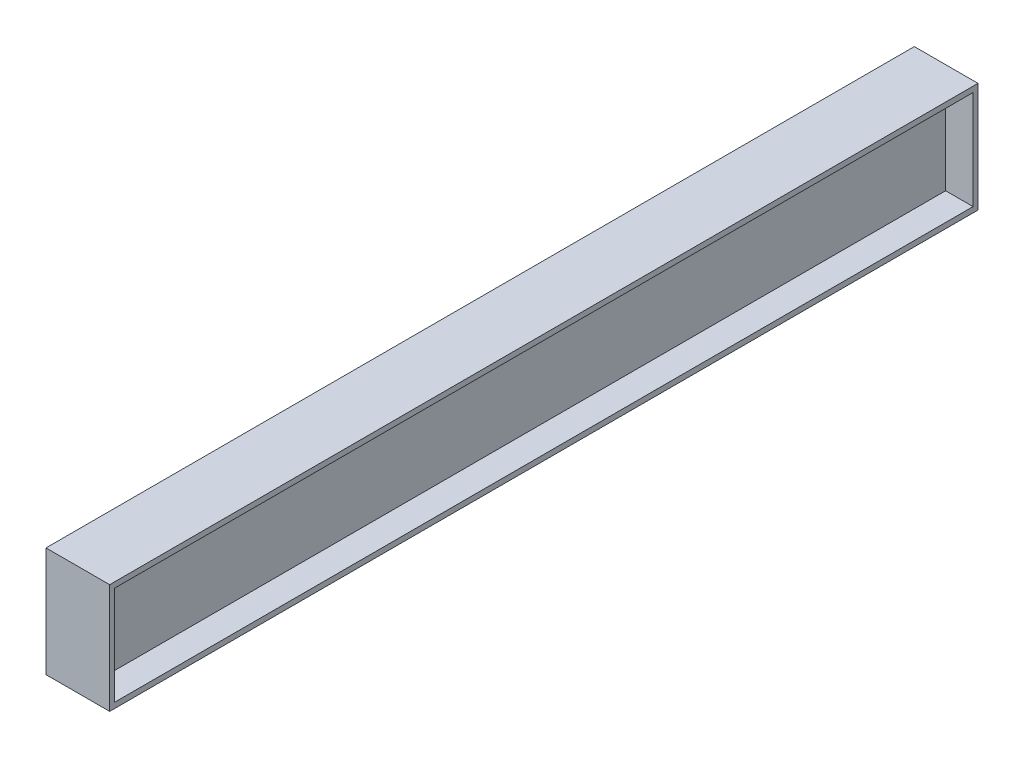
ISO-10303-21;
HEADER;
FILE_DESCRIPTION(('STEP AP214'),'2;1');
FILE_NAME('part.step','',(''),(''),'','','');
FILE_SCHEMA(('AUTOMOTIVE_DESIGN { 1 0 10303 214 1 1 1 1 }'));
ENDSEC;
DATA;
#1=APPLICATION_CONTEXT('core data for automotive mechanical design processes');
#2=APPLICATION_PROTOCOL_DEFINITION('international standard','automotive_design',2000,#1);
#3=PRODUCT_CONTEXT('',#1,'mechanical');
#4=PRODUCT('Part','Part','',(#3));
#5=PRODUCT_RELATED_PRODUCT_CATEGORY('part','',(#4));
#6=PRODUCT_DEFINITION_FORMATION('','',#4);
#7=PRODUCT_DEFINITION_CONTEXT('part definition',#1,'design');
#8=PRODUCT_DEFINITION('design','',#6,#7);
#9=PRODUCT_DEFINITION_SHAPE('','',#8);
#10=(LENGTH_UNIT() NAMED_UNIT(*) SI_UNIT(.MILLI.,.METRE.));
#11=(NAMED_UNIT(*) PLANE_ANGLE_UNIT() SI_UNIT($,.RADIAN.));
#12=(NAMED_UNIT(*) SI_UNIT($,.STERADIAN.) SOLID_ANGLE_UNIT());
#13=UNCERTAINTY_MEASURE_WITH_UNIT(LENGTH_MEASURE(1.E-05),#10,'distance_accuracy_value','');
#14=(GEOMETRIC_REPRESENTATION_CONTEXT(3) GLOBAL_UNCERTAINTY_ASSIGNED_CONTEXT((#13)) GLOBAL_UNIT_ASSIGNED_CONTEXT((#10,
#11,#12)) REPRESENTATION_CONTEXT('',''));
#15=CARTESIAN_POINT('',(0.,0.,0.));
#16=DIRECTION('',(0.,0.,1.));
#17=DIRECTION('',(1.,0.,0.));
#18=AXIS2_PLACEMENT_3D('',#15,#16,#17);
#19=CARTESIAN_POINT('',(96.6666666666667,-154.453875319659,2636.78));
#20=DIRECTION('',(0.,-1.,0.));
#21=DIRECTION('',(0.,0.,-1.));
#22=AXIS2_PLACEMENT_3D('',#19,#20,#21);
#23=PLANE('',#22);
#24=DIRECTION('',(1.,0.,0.));
#25=VECTOR('',#24,1.);
#26=CARTESIAN_POINT('',(-96.6663333333334,-154.453875319659,2621.78));
#27=LINE('',#26,#25);
#28=CARTESIAN_POINT('',(13.3333333333333,-154.453875319659,2621.78));
#29=VERTEX_POINT('',#28);
#30=CARTESIAN_POINT('',(96.6666666666667,-154.453875319659,2621.78));
#31=VERTEX_POINT('',#30);
#32=EDGE_CURVE('E149',#29,#31,#27,.T.);
#33=ORIENTED_EDGE('',*,*,#32,.T.);
#34=DIRECTION('',(0.,0.,-1.));
#35=VECTOR('',#34,1.);
#36=CARTESIAN_POINT('',(96.6666666666667,-154.453875319659,2636.78));
#37=LINE('',#36,#35);
#38=CARTESIAN_POINT('',(96.6666666666667,-154.453875319659,15.0000000000001));
#39=VERTEX_POINT('',#38);
#40=EDGE_CURVE('E232',#31,#39,#37,.T.);
#41=ORIENTED_EDGE('',*,*,#40,.T.);
#42=DIRECTION('',(-1.,0.,0.));
#43=VECTOR('',#42,1.);
#44=CARTESIAN_POINT('',(96.6666666666667,-154.453875319659,15.));
#45=LINE('',#44,#43);
#46=CARTESIAN_POINT('',(13.3333333333333,-154.453875319659,15.0000000000001));
#47=VERTEX_POINT('',#46);
#48=EDGE_CURVE('E174',#39,#47,#45,.T.);
#49=ORIENTED_EDGE('',*,*,#48,.T.);
#50=DIRECTION('',(0.,0.,-1.));
#51=VECTOR('',#50,1.);
#52=CARTESIAN_POINT('',(13.3333333333333,-154.453875319659,2636.78));
#53=LINE('',#52,#51);
#54=EDGE_CURVE('E230',#29,#47,#53,.T.);
#55=ORIENTED_EDGE('',*,*,#54,.F.);
#56=EDGE_LOOP('',(#33,#41,#49,#55));
#57=FACE_BOUND('',#56,.T.);
#58=ADVANCED_FACE('F35',(#57),#23,.F.);
#59=CARTESIAN_POINT('',(13.3333333333333,-154.453875319659,2636.78));
#60=DIRECTION('',(-1.,0.,0.));
#61=DIRECTION('',(0.,0.,1.));
#62=AXIS2_PLACEMENT_3D('',#59,#60,#61);
#63=PLANE('',#62);
#64=DIRECTION('',(0.,1.,0.));
#65=VECTOR('',#64,1.);
#66=CARTESIAN_POINT('',(13.3333333333333,-154.453875319659,2621.78));
#67=LINE('',#66,#65);
#68=CARTESIAN_POINT('',(13.3333333333333,145.546124680341,2621.78));
#69=VERTEX_POINT('',#68);
#70=EDGE_CURVE('E162',#29,#69,#67,.T.);
#71=ORIENTED_EDGE('',*,*,#70,.F.);
#72=ORIENTED_EDGE('',*,*,#54,.T.);
#73=DIRECTION('',(0.,-1.,0.));
#74=VECTOR('',#73,1.);
#75=CARTESIAN_POINT('',(13.3333333333333,-154.453875319659,15.0000000000001));
#76=LINE('',#75,#74);
#77=CARTESIAN_POINT('',(13.3333333333333,145.546124680341,15.0000000000001));
#78=VERTEX_POINT('',#77);
#79=EDGE_CURVE('E192',#78,#47,#76,.T.);
#80=ORIENTED_EDGE('',*,*,#79,.F.);
#81=DIRECTION('',(0.,0.,-1.));
#82=VECTOR('',#81,1.);
#83=CARTESIAN_POINT('',(13.3333333333333,145.546124680341,2636.78));
#84=LINE('',#83,#82);
#85=EDGE_CURVE('E228',#69,#78,#84,.T.);
#86=ORIENTED_EDGE('',*,*,#85,.F.);
#87=EDGE_LOOP('',(#71,#72,#80,#86));
#88=FACE_BOUND('',#87,.T.);
#89=ADVANCED_FACE('F296',(#88),#63,.F.);
#90=CARTESIAN_POINT('',(96.6666666666667,145.546124680341,2636.78));
#91=DIRECTION('',(0.,1.,0.));
#92=DIRECTION('',(0.,0.,1.));
#93=AXIS2_PLACEMENT_3D('',#90,#91,#92);
#94=PLANE('',#93);
#95=DIRECTION('',(-1.,0.,0.));
#96=VECTOR('',#95,1.);
#97=CARTESIAN_POINT('',(-96.6663333333334,145.546124680341,2621.78));
#98=LINE('',#97,#96);
#99=CARTESIAN_POINT('',(96.6666666666667,145.546124680341,2621.78));
#100=VERTEX_POINT('',#99);
#101=EDGE_CURVE('E160',#100,#69,#98,.T.);
#102=ORIENTED_EDGE('',*,*,#101,.T.);
#103=ORIENTED_EDGE('',*,*,#85,.T.);
#104=DIRECTION('',(1.,0.,0.));
#105=VECTOR('',#104,1.);
#106=CARTESIAN_POINT('',(96.6666666666667,145.546124680341,15.));
#107=LINE('',#106,#105);
#108=CARTESIAN_POINT('',(96.6666666666667,145.546124680341,14.9999999999997));
#109=VERTEX_POINT('',#108);
#110=EDGE_CURVE('E180',#78,#109,#107,.T.);
#111=ORIENTED_EDGE('',*,*,#110,.T.);
#112=DIRECTION('',(0.,0.,-1.));
#113=VECTOR('',#112,1.);
#114=CARTESIAN_POINT('',(96.6666666666667,145.546124680341,2636.78));
#115=LINE('',#114,#113);
#116=EDGE_CURVE('E226',#100,#109,#115,.T.);
#117=ORIENTED_EDGE('',*,*,#116,.F.);
#118=EDGE_LOOP('',(#102,#103,#111,#117));
#119=FACE_BOUND('',#118,.T.);
#120=ADVANCED_FACE('F282',(#119),#94,.F.);
#121=CARTESIAN_POINT('',(-13.3333333333333,145.546124680341,2636.78));
#122=DIRECTION('',(0.,1.,0.));
#123=DIRECTION('',(0.,0.,1.));
#124=AXIS2_PLACEMENT_3D('',#121,#122,#123);
#125=PLANE('',#124);
#126=CARTESIAN_POINT('',(-13.3333333333333,145.546124680341,2621.78));
#127=VERTEX_POINT('',#126);
#128=CARTESIAN_POINT('',(-96.6663333333334,145.546124680341,2621.78));
#129=VERTEX_POINT('',#128);
#130=EDGE_CURVE('E165',#127,#129,#98,.T.);
#131=ORIENTED_EDGE('',*,*,#130,.T.);
#132=DIRECTION('',(0.,0.,-1.));
#133=VECTOR('',#132,1.);
#134=CARTESIAN_POINT('',(-96.6663333333334,145.546124680341,2636.78));
#135=LINE('',#134,#133);
#136=CARTESIAN_POINT('',(-96.6663333333334,145.546124680341,15.0000000000001));
#137=VERTEX_POINT('',#136);
#138=EDGE_CURVE('E157',#129,#137,#135,.T.);
#139=ORIENTED_EDGE('',*,*,#138,.T.);
#140=CARTESIAN_POINT('',(-13.3333333333333,145.546124680341,15.0000000000001));
#141=VERTEX_POINT('',#140);
#142=EDGE_CURVE('E185',#137,#141,#107,.T.);
#143=ORIENTED_EDGE('',*,*,#142,.T.);
#144=DIRECTION('',(0.,0.,-1.));
#145=VECTOR('',#144,1.);
#146=CARTESIAN_POINT('',(-13.3333333333333,145.546124680341,2636.78));
#147=LINE('',#146,#145);
#148=EDGE_CURVE('E207',#127,#141,#147,.T.);
#149=ORIENTED_EDGE('',*,*,#148,.F.);
#150=EDGE_LOOP('',(#131,#139,#143,#149));
#151=FACE_BOUND('',#150,.T.);
#152=ADVANCED_FACE('F315',(#151),#125,.F.);
#153=CARTESIAN_POINT('',(-13.3333333333333,-4.45387531965855,2636.78));
#154=DIRECTION('',(1.,0.,0.));
#155=DIRECTION('',(0.,1.,0.));
#156=AXIS2_PLACEMENT_3D('',#153,#154,#155);
#157=PLANE('',#156);
#158=DIRECTION('',(0.,-1.,0.));
#159=VECTOR('',#158,1.);
#160=CARTESIAN_POINT('',(-13.3333333333333,-4.45387531965855,2621.78));
#161=LINE('',#160,#159);
#162=CARTESIAN_POINT('',(-13.3333333333333,-154.453875319659,2621.78));
#163=VERTEX_POINT('',#162);
#164=EDGE_CURVE('E145',#127,#163,#161,.T.);
#165=ORIENTED_EDGE('',*,*,#164,.F.);
#166=ORIENTED_EDGE('',*,*,#148,.T.);
#167=DIRECTION('',(0.,1.,0.));
#168=VECTOR('',#167,1.);
#169=CARTESIAN_POINT('',(-13.3333333333333,-4.45387531965855,15.0000000000001));
#170=LINE('',#169,#168);
#171=CARTESIAN_POINT('',(-13.3333333333333,-154.453875319659,15.0000000000001));
#172=VERTEX_POINT('',#171);
#173=EDGE_CURVE('E11',#172,#141,#170,.T.);
#174=ORIENTED_EDGE('',*,*,#173,.F.);
#175=DIRECTION('',(0.,0.,-1.));
#176=VECTOR('',#175,1.);
#177=CARTESIAN_POINT('',(-13.3333333333333,-154.453875319659,2636.78));
#178=LINE('',#177,#176);
#179=EDGE_CURVE('E43',#163,#172,#178,.T.);
#180=ORIENTED_EDGE('',*,*,#179,.F.);
#181=EDGE_LOOP('',(#165,#166,#174,#180));
#182=FACE_BOUND('',#181,.T.);
#183=ADVANCED_FACE('F243',(#182),#157,.F.);
#184=CARTESIAN_POINT('',(-13.3333333333333,-154.453875319659,2636.78));
#185=DIRECTION('',(0.,-1.,0.));
#186=DIRECTION('',(0.,0.,-1.));
#187=AXIS2_PLACEMENT_3D('',#184,#185,#186);
#188=PLANE('',#187);
#189=DIRECTION('',(-1.,0.,0.));
#190=VECTOR('',#189,1.);
#191=CARTESIAN_POINT('',(-13.3333333333333,-154.453875319659,2636.78));
#192=LINE('',#191,#190);
#193=CARTESIAN_POINT('',(-96.6663333333334,-154.453875319659,2636.78));
#194=VERTEX_POINT('',#193);
#195=CARTESIAN_POINT('',(-96.6666666666666,-154.453875319659,2636.78));
#196=VERTEX_POINT('',#195);
#197=EDGE_CURVE('E159',#194,#196,#192,.T.);
#198=ORIENTED_EDGE('',*,*,#197,.F.);
#199=DIRECTION('',(0.,0.,1.));
#200=VECTOR('',#199,1.);
#201=CARTESIAN_POINT('',(-96.6663333333334,-154.453875319659,2621.78));
#202=LINE('',#201,#200);
#203=CARTESIAN_POINT('',(-96.6663333333334,-154.453875319659,2621.78));
#204=VERTEX_POINT('',#203);
#205=EDGE_CURVE('E154',#204,#194,#202,.T.);
#206=ORIENTED_EDGE('',*,*,#205,.F.);
#207=EDGE_CURVE('E139',#204,#163,#27,.T.);
#208=ORIENTED_EDGE('',*,*,#207,.T.);
#209=ORIENTED_EDGE('',*,*,#179,.T.);
#210=CARTESIAN_POINT('',(-96.6666666666666,-154.453875319659,14.9999999999997));
#211=VERTEX_POINT('',#210);
#212=EDGE_CURVE('E58',#172,#211,#45,.T.);
#213=ORIENTED_EDGE('',*,*,#212,.T.);
#214=DIRECTION('',(0.,0.,-1.));
#215=VECTOR('',#214,1.);
#216=CARTESIAN_POINT('',(-96.6666666666666,-154.453875319659,2636.78));
#217=LINE('',#216,#215);
#218=EDGE_CURVE('E240',#196,#211,#217,.T.);
#219=ORIENTED_EDGE('',*,*,#218,.F.);
#220=EDGE_LOOP('',(#198,#206,#208,#209,#213,#219));
#221=FACE_BOUND('',#220,.T.);
#222=ADVANCED_FACE('F37',(#221),#188,.F.);
#223=CARTESIAN_POINT('',(-96.6666666666666,-171.120541986325,2636.78));
#224=DIRECTION('',(1.,0.,0.));
#225=DIRECTION('',(0.,0.,-1.));
#226=AXIS2_PLACEMENT_3D('',#223,#224,#225);
#227=PLANE('',#226);
#228=DIRECTION('',(0.,-1.,0.));
#229=VECTOR('',#228,1.);
#230=CARTESIAN_POINT('',(-96.6666666666666,-171.120541986325,0.));
#231=LINE('',#230,#229);
#232=CARTESIAN_POINT('',(-96.6666666666666,145.546124680341,0.));
#233=VERTEX_POINT('',#232);
#234=CARTESIAN_POINT('',(-96.6666666666666,-171.120541986325,0.));
#235=VERTEX_POINT('',#234);
#236=EDGE_CURVE('E195',#233,#235,#231,.T.);
#237=ORIENTED_EDGE('',*,*,#236,.T.);
#238=DIRECTION('',(0.,0.,-1.));
#239=VECTOR('',#238,1.);
#240=CARTESIAN_POINT('',(-96.6666666666666,-171.120541986325,2636.78));
#241=LINE('',#240,#239);
#242=CARTESIAN_POINT('',(-96.6666666666666,-171.120541986325,2636.78));
#243=VERTEX_POINT('',#242);
#244=EDGE_CURVE('E237',#243,#235,#241,.T.);
#245=ORIENTED_EDGE('',*,*,#244,.F.);
#246=DIRECTION('',(0.,-1.,0.));
#247=VECTOR('',#246,1.);
#248=CARTESIAN_POINT('',(-96.6666666666666,-171.120541986325,2636.78));
#249=LINE('',#248,#247);
#250=EDGE_CURVE('E197',#196,#243,#249,.T.);
#251=ORIENTED_EDGE('',*,*,#250,.F.);
#252=ORIENTED_EDGE('',*,*,#218,.T.);
#253=DIRECTION('',(0.,1.,0.));
#254=VECTOR('',#253,1.);
#255=CARTESIAN_POINT('',(-96.6666666666666,145.546124680341,15.));
#256=LINE('',#255,#254);
#257=CARTESIAN_POINT('',(-96.6666666666666,145.546124680341,15.));
#258=VERTEX_POINT('',#257);
#259=EDGE_CURVE('E177',#211,#258,#256,.T.);
#260=ORIENTED_EDGE('',*,*,#259,.T.);
#261=DIRECTION('',(0.,0.,-1.));
#262=VECTOR('',#261,1.);
#263=CARTESIAN_POINT('',(-96.6666666666666,145.546124680341,15.));
#264=LINE('',#263,#262);
#265=EDGE_CURVE('E184',#258,#233,#264,.T.);
#266=ORIENTED_EDGE('',*,*,#265,.T.);
#267=EDGE_LOOP('',(#237,#245,#251,#252,#260,#266));
#268=FACE_BOUND('',#267,.T.);
#269=ADVANCED_FACE('F252',(#268),#227,.F.);
#270=CARTESIAN_POINT('',(-96.6666666666666,-171.120541986325,2636.78));
#271=DIRECTION('',(0.,1.,0.));
#272=DIRECTION('',(0.,0.,1.));
#273=AXIS2_PLACEMENT_3D('',#270,#271,#272);
#274=PLANE('',#273);
#275=DIRECTION('',(1.,0.,0.));
#276=VECTOR('',#275,1.);
#277=CARTESIAN_POINT('',(-96.6666666666666,-171.120541986325,0.));
#278=LINE('',#277,#276);
#279=CARTESIAN_POINT('',(96.6666666666667,-171.120541986325,0.));
#280=VERTEX_POINT('',#279);
#281=EDGE_CURVE('E209',#235,#280,#278,.T.);
#282=ORIENTED_EDGE('',*,*,#281,.T.);
#283=DIRECTION('',(0.,0.,-1.));
#284=VECTOR('',#283,1.);
#285=CARTESIAN_POINT('',(96.6666666666667,-171.120541986325,2636.78));
#286=LINE('',#285,#284);
#287=CARTESIAN_POINT('',(96.6666666666667,-171.120541986325,2636.78));
#288=VERTEX_POINT('',#287);
#289=EDGE_CURVE('E234',#288,#280,#286,.T.);
#290=ORIENTED_EDGE('',*,*,#289,.F.);
#291=DIRECTION('',(1.,0.,0.));
#292=VECTOR('',#291,1.);
#293=CARTESIAN_POINT('',(-96.6666666666666,-171.120541986325,2636.78));
#294=LINE('',#293,#292);
#295=EDGE_CURVE('E200',#243,#288,#294,.T.);
#296=ORIENTED_EDGE('',*,*,#295,.F.);
#297=ORIENTED_EDGE('',*,*,#244,.T.);
#298=EDGE_LOOP('',(#282,#290,#296,#297));
#299=FACE_BOUND('',#298,.T.);
#300=ADVANCED_FACE('F262',(#299),#274,.F.);
#301=CARTESIAN_POINT('',(96.6666666666667,162.212791347008,2636.78));
#302=DIRECTION('',(-1.,0.,0.));
#303=DIRECTION('',(0.,-1.,0.));
#304=AXIS2_PLACEMENT_3D('',#301,#302,#303);
#305=PLANE('',#304);
#306=DIRECTION('',(0.,1.,0.));
#307=VECTOR('',#306,1.);
#308=CARTESIAN_POINT('',(96.6666666666667,145.546124680341,2621.78));
#309=LINE('',#308,#307);
#310=EDGE_CURVE('E148',#31,#100,#309,.T.);
#311=ORIENTED_EDGE('',*,*,#310,.T.);
#312=ORIENTED_EDGE('',*,*,#116,.T.);
#313=DIRECTION('',(0.,-1.,0.));
#314=VECTOR('',#313,1.);
#315=CARTESIAN_POINT('',(96.6666666666667,145.546124680341,15.));
#316=LINE('',#315,#314);
#317=EDGE_CURVE('E171',#109,#39,#316,.T.);
#318=ORIENTED_EDGE('',*,*,#317,.T.);
#319=ORIENTED_EDGE('',*,*,#40,.F.);
#320=EDGE_LOOP('',(#311,#312,#318,#319));
#321=FACE_BOUND('',#320,.T.);
#322=DIRECTION('',(0.,1.,0.));
#323=VECTOR('',#322,1.);
#324=CARTESIAN_POINT('',(96.6666666666667,162.212791347008,0.));
#325=LINE('',#324,#323);
#326=CARTESIAN_POINT('',(96.6666666666667,162.212791347008,0.));
#327=VERTEX_POINT('',#326);
#328=EDGE_CURVE('E212',#280,#327,#325,.T.);
#329=ORIENTED_EDGE('',*,*,#328,.T.);
#330=DIRECTION('',(0.,0.,-1.));
#331=VECTOR('',#330,1.);
#332=CARTESIAN_POINT('',(96.6666666666667,162.212791347008,2636.78));
#333=LINE('',#332,#331);
#334=CARTESIAN_POINT('',(96.6666666666667,162.212791347008,2636.78));
#335=VERTEX_POINT('',#334);
#336=EDGE_CURVE('E223',#335,#327,#333,.T.);
#337=ORIENTED_EDGE('',*,*,#336,.F.);
#338=DIRECTION('',(0.,1.,0.));
#339=VECTOR('',#338,1.);
#340=CARTESIAN_POINT('',(96.6666666666667,-171.120541986325,2636.78));
#341=LINE('',#340,#339);
#342=EDGE_CURVE('E202',#288,#335,#341,.T.);
#343=ORIENTED_EDGE('',*,*,#342,.F.);
#344=ORIENTED_EDGE('',*,*,#289,.T.);
#345=EDGE_LOOP('',(#329,#337,#343,#344));
#346=FACE_BOUND('',#345,.T.);
#347=ADVANCED_FACE('F265',(#321,#346),#305,.F.);
#348=CARTESIAN_POINT('',(-96.6663333333334,162.212791347008,2636.78));
#349=DIRECTION('',(0.,-1.,0.));
#350=DIRECTION('',(0.,0.,-1.));
#351=AXIS2_PLACEMENT_3D('',#348,#349,#350);
#352=PLANE('',#351);
#353=DIRECTION('',(-1.,0.,0.));
#354=VECTOR('',#353,1.);
#355=CARTESIAN_POINT('',(-96.6663333333334,162.212791347008,0.));
#356=LINE('',#355,#354);
#357=CARTESIAN_POINT('',(-96.6663333333334,162.212791347008,0.));
#358=VERTEX_POINT('',#357);
#359=EDGE_CURVE('E215',#327,#358,#356,.T.);
#360=ORIENTED_EDGE('',*,*,#359,.T.);
#361=DIRECTION('',(0.,0.,-1.));
#362=VECTOR('',#361,1.);
#363=CARTESIAN_POINT('',(-96.6663333333334,162.212791347008,2636.78));
#364=LINE('',#363,#362);
#365=CARTESIAN_POINT('',(-96.6663333333334,162.212791347008,2636.78));
#366=VERTEX_POINT('',#365);
#367=EDGE_CURVE('E220',#366,#358,#364,.T.);
#368=ORIENTED_EDGE('',*,*,#367,.F.);
#369=DIRECTION('',(-1.,0.,0.));
#370=VECTOR('',#369,1.);
#371=CARTESIAN_POINT('',(0.,162.212791347008,2636.78));
#372=LINE('',#371,#370);
#373=EDGE_CURVE('E204',#335,#366,#372,.T.);
#374=ORIENTED_EDGE('',*,*,#373,.F.);
#375=ORIENTED_EDGE('',*,*,#336,.T.);
#376=EDGE_LOOP('',(#360,#368,#374,#375));
#377=FACE_BOUND('',#376,.T.);
#378=ADVANCED_FACE('F269',(#377),#352,.F.);
#379=CARTESIAN_POINT('',(-96.6663333333334,145.546124680341,2636.78));
#380=DIRECTION('',(1.,0.,0.));
#381=DIRECTION('',(0.,0.,-1.));
#382=AXIS2_PLACEMENT_3D('',#379,#380,#381);
#383=PLANE('',#382);
#384=DIRECTION('',(0.,-1.,0.));
#385=VECTOR('',#384,1.);
#386=CARTESIAN_POINT('',(-96.6663333333334,145.546124680341,0.));
#387=LINE('',#386,#385);
#388=CARTESIAN_POINT('',(-96.6663333333334,145.546124680341,0.));
#389=VERTEX_POINT('',#388);
#390=EDGE_CURVE('E198',#358,#389,#387,.T.);
#391=ORIENTED_EDGE('',*,*,#390,.T.);
#392=DIRECTION('',(0.,0.,1.));
#393=VECTOR('',#392,1.);
#394=CARTESIAN_POINT('',(-96.6663333333334,145.546124680341,2636.78));
#395=LINE('',#394,#393);
#396=EDGE_CURVE('E190',#389,#137,#395,.T.);
#397=ORIENTED_EDGE('',*,*,#396,.T.);
#398=ORIENTED_EDGE('',*,*,#138,.F.);
#399=DIRECTION('',(0.,-1.,0.));
#400=VECTOR('',#399,1.);
#401=CARTESIAN_POINT('',(-96.6663333333334,145.546124680341,2621.78));
#402=LINE('',#401,#400);
#403=EDGE_CURVE('E142',#129,#204,#402,.T.);
#404=ORIENTED_EDGE('',*,*,#403,.T.);
#405=ORIENTED_EDGE('',*,*,#205,.T.);
#406=DIRECTION('',(0.,-1.,0.));
#407=VECTOR('',#406,1.);
#408=CARTESIAN_POINT('',(-96.6663333333334,145.546124680341,2636.78));
#409=LINE('',#408,#407);
#410=EDGE_CURVE('E50',#366,#194,#409,.T.);
#411=ORIENTED_EDGE('',*,*,#410,.F.);
#412=ORIENTED_EDGE('',*,*,#367,.T.);
#413=EDGE_LOOP('',(#391,#397,#398,#404,#405,#411,#412));
#414=FACE_BOUND('',#413,.T.);
#415=ADVANCED_FACE('F153',(#414),#383,.F.);
#416=CARTESIAN_POINT('',(0.,0.,2636.78));
#417=DIRECTION('',(0.,0.,-1.));
#418=DIRECTION('',(-1.,0.,0.));
#419=AXIS2_PLACEMENT_3D('',#416,#417,#418);
#420=PLANE('',#419);
#421=ORIENTED_EDGE('',*,*,#342,.T.);
#422=ORIENTED_EDGE('',*,*,#373,.T.);
#423=ORIENTED_EDGE('',*,*,#410,.T.);
#424=ORIENTED_EDGE('',*,*,#197,.T.);
#425=ORIENTED_EDGE('',*,*,#250,.T.);
#426=ORIENTED_EDGE('',*,*,#295,.T.);
#427=EDGE_LOOP('',(#421,#422,#423,#424,#425,#426));
#428=FACE_BOUND('',#427,.T.);
#429=ADVANCED_FACE('F257',(#428),#420,.F.);
#430=CARTESIAN_POINT('',(0.,0.,0.));
#431=DIRECTION('',(0.,0.,-1.));
#432=DIRECTION('',(-1.,0.,0.));
#433=AXIS2_PLACEMENT_3D('',#430,#431,#432);
#434=PLANE('',#433);
#435=DIRECTION('',(1.,0.,0.));
#436=VECTOR('',#435,1.);
#437=CARTESIAN_POINT('',(96.6666666666667,145.546124680341,0.));
#438=LINE('',#437,#436);
#439=EDGE_CURVE('E170',#233,#389,#438,.T.);
#440=ORIENTED_EDGE('',*,*,#439,.T.);
#441=ORIENTED_EDGE('',*,*,#390,.F.);
#442=ORIENTED_EDGE('',*,*,#359,.F.);
#443=ORIENTED_EDGE('',*,*,#328,.F.);
#444=ORIENTED_EDGE('',*,*,#281,.F.);
#445=ORIENTED_EDGE('',*,*,#236,.F.);
#446=EDGE_LOOP('',(#440,#441,#442,#443,#444,#445));
#447=FACE_BOUND('',#446,.T.);
#448=ADVANCED_FACE('F273',(#447),#434,.T.);
#449=CARTESIAN_POINT('',(0.,0.,15.));
#450=DIRECTION('',(0.,0.,-1.));
#451=DIRECTION('',(-1.,0.,0.));
#452=AXIS2_PLACEMENT_3D('',#449,#450,#451);
#453=PLANE('',#452);
#454=ORIENTED_EDGE('',*,*,#212,.F.);
#455=ORIENTED_EDGE('',*,*,#173,.T.);
#456=ORIENTED_EDGE('',*,*,#142,.F.);
#457=EDGE_CURVE('E181',#258,#137,#107,.T.);
#458=ORIENTED_EDGE('',*,*,#457,.F.);
#459=ORIENTED_EDGE('',*,*,#259,.F.);
#460=EDGE_LOOP('',(#454,#455,#456,#458,#459));
#461=FACE_BOUND('',#460,.T.);
#462=ADVANCED_FACE('F249',(#461),#453,.F.);
#463=CARTESIAN_POINT('',(96.6666666666667,145.546124680341,15.));
#464=DIRECTION('',(0.,1.,0.));
#465=DIRECTION('',(0.,0.,1.));
#466=AXIS2_PLACEMENT_3D('',#463,#464,#465);
#467=PLANE('',#466);
#468=ORIENTED_EDGE('',*,*,#396,.F.);
#469=ORIENTED_EDGE('',*,*,#439,.F.);
#470=ORIENTED_EDGE('',*,*,#265,.F.);
#471=ORIENTED_EDGE('',*,*,#457,.T.);
#472=EDGE_LOOP('',(#468,#469,#470,#471));
#473=FACE_BOUND('',#472,.T.);
#474=ADVANCED_FACE('F275',(#473),#467,.T.);
#475=ORIENTED_EDGE('',*,*,#110,.F.);
#476=ORIENTED_EDGE('',*,*,#79,.T.);
#477=ORIENTED_EDGE('',*,*,#48,.F.);
#478=ORIENTED_EDGE('',*,*,#317,.F.);
#479=EDGE_LOOP('',(#475,#476,#477,#478));
#480=FACE_BOUND('',#479,.T.);
#481=ADVANCED_FACE('F287',(#480),#453,.F.);
#482=CARTESIAN_POINT('',(0.,0.,2621.78));
#483=DIRECTION('',(0.,0.,1.));
#484=DIRECTION('',(1.,0.,0.));
#485=AXIS2_PLACEMENT_3D('',#482,#483,#484);
#486=PLANE('',#485);
#487=ORIENTED_EDGE('',*,*,#130,.F.);
#488=ORIENTED_EDGE('',*,*,#164,.T.);
#489=ORIENTED_EDGE('',*,*,#207,.F.);
#490=ORIENTED_EDGE('',*,*,#403,.F.);
#491=EDGE_LOOP('',(#487,#488,#489,#490));
#492=FACE_BOUND('',#491,.T.);
#493=ADVANCED_FACE('F141',(#492),#486,.F.);
#494=ORIENTED_EDGE('',*,*,#32,.F.);
#495=ORIENTED_EDGE('',*,*,#70,.T.);
#496=ORIENTED_EDGE('',*,*,#101,.F.);
#497=ORIENTED_EDGE('',*,*,#310,.F.);
#498=EDGE_LOOP('',(#494,#495,#496,#497));
#499=FACE_BOUND('',#498,.T.);
#500=ADVANCED_FACE('F293',(#499),#486,.F.);
#501=CLOSED_SHELL('',(#58,#89,#120,#152,#183,#222,#269,#300,#347,#378,#415,#429,#448,#462,#474,
#481,#493,#500));
#502=MANIFOLD_SOLID_BREP('B2',#501);
#503=ADVANCED_BREP_SHAPE_REPRESENTATION('',(#18,#502),#14);
#504=SHAPE_DEFINITION_REPRESENTATION(#9,#503);
ENDSEC;
END-ISO-10303-21;
